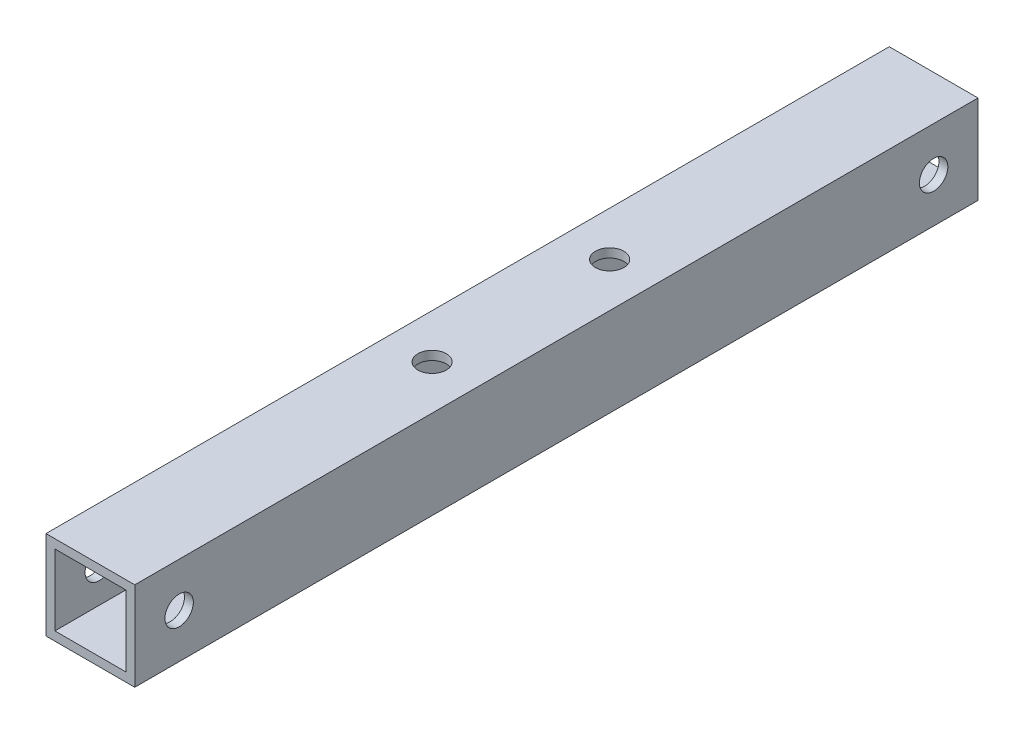
ISO-10303-21;
HEADER;
FILE_DESCRIPTION(('STEP AP214'),'2;1');
FILE_NAME('part.step','',(''),(''),'','','');
FILE_SCHEMA(('AUTOMOTIVE_DESIGN { 1 0 10303 214 1 1 1 1 }'));
ENDSEC;
DATA;
#1=APPLICATION_CONTEXT('core data for automotive mechanical design processes');
#2=APPLICATION_PROTOCOL_DEFINITION('international standard','automotive_design',2000,#1);
#3=PRODUCT_CONTEXT('',#1,'mechanical');
#4=PRODUCT('Part','Part','',(#3));
#5=PRODUCT_RELATED_PRODUCT_CATEGORY('part','',(#4));
#6=PRODUCT_DEFINITION_FORMATION('','',#4);
#7=PRODUCT_DEFINITION_CONTEXT('part definition',#1,'design');
#8=PRODUCT_DEFINITION('design','',#6,#7);
#9=PRODUCT_DEFINITION_SHAPE('','',#8);
#10=(LENGTH_UNIT() NAMED_UNIT(*) SI_UNIT(.MILLI.,.METRE.));
#11=(NAMED_UNIT(*) PLANE_ANGLE_UNIT() SI_UNIT($,.RADIAN.));
#12=(NAMED_UNIT(*) SI_UNIT($,.STERADIAN.) SOLID_ANGLE_UNIT());
#13=UNCERTAINTY_MEASURE_WITH_UNIT(LENGTH_MEASURE(1.E-05),#10,'distance_accuracy_value','');
#14=(GEOMETRIC_REPRESENTATION_CONTEXT(3) GLOBAL_UNCERTAINTY_ASSIGNED_CONTEXT((#13)) GLOBAL_UNIT_ASSIGNED_CONTEXT((#10,
#11,#12)) REPRESENTATION_CONTEXT('',''));
#15=CARTESIAN_POINT('',(0.,0.,0.));
#16=DIRECTION('',(0.,0.,1.));
#17=DIRECTION('',(1.,0.,0.));
#18=AXIS2_PLACEMENT_3D('',#15,#16,#17);
#19=CARTESIAN_POINT('',(0.,0.,95.));
#20=DIRECTION('',(0.,0.,1.));
#21=DIRECTION('',(1.,0.,0.));
#22=AXIS2_PLACEMENT_3D('',#19,#20,#21);
#23=PLANE('',#22);
#24=DIRECTION('',(0.,-1.,0.));
#25=VECTOR('',#24,1.);
#26=CARTESIAN_POINT('',(-5.,5.,95.));
#27=LINE('',#26,#25);
#28=CARTESIAN_POINT('',(-5.,5.,95.));
#29=VERTEX_POINT('',#28);
#30=CARTESIAN_POINT('',(-5.,-5.,95.));
#31=VERTEX_POINT('',#30);
#32=EDGE_CURVE('E164',#29,#31,#27,.T.);
#33=ORIENTED_EDGE('',*,*,#32,.T.);
#34=DIRECTION('',(1.,0.,0.));
#35=VECTOR('',#34,1.);
#36=CARTESIAN_POINT('',(5.,-5.,95.));
#37=LINE('',#36,#35);
#38=CARTESIAN_POINT('',(5.,-5.,95.));
#39=VERTEX_POINT('',#38);
#40=EDGE_CURVE('E167',#31,#39,#37,.T.);
#41=ORIENTED_EDGE('',*,*,#40,.T.);
#42=DIRECTION('',(0.,1.,0.));
#43=VECTOR('',#42,1.);
#44=CARTESIAN_POINT('',(5.,5.,95.));
#45=LINE('',#44,#43);
#46=CARTESIAN_POINT('',(5.,5.,95.));
#47=VERTEX_POINT('',#46);
#48=EDGE_CURVE('E170',#39,#47,#45,.T.);
#49=ORIENTED_EDGE('',*,*,#48,.T.);
#50=DIRECTION('',(-1.,0.,0.));
#51=VECTOR('',#50,1.);
#52=CARTESIAN_POINT('',(5.,5.,95.));
#53=LINE('',#52,#51);
#54=EDGE_CURVE('E172',#47,#29,#53,.T.);
#55=ORIENTED_EDGE('',*,*,#54,.T.);
#56=EDGE_LOOP('',(#33,#41,#49,#55));
#57=FACE_BOUND('',#56,.T.);
#58=DIRECTION('',(1.,0.,0.));
#59=VECTOR('',#58,1.);
#60=CARTESIAN_POINT('',(0.,-4.,95.));
#61=LINE('',#60,#59);
#62=CARTESIAN_POINT('',(-4.,-4.,95.));
#63=VERTEX_POINT('',#62);
#64=CARTESIAN_POINT('',(4.,-4.,95.));
#65=VERTEX_POINT('',#64);
#66=EDGE_CURVE('E134',#63,#65,#61,.T.);
#67=ORIENTED_EDGE('',*,*,#66,.F.);
#68=DIRECTION('',(0.,-1.,0.));
#69=VECTOR('',#68,1.);
#70=CARTESIAN_POINT('',(-4.,0.,95.));
#71=LINE('',#70,#69);
#72=CARTESIAN_POINT('',(-4.,4.,95.));
#73=VERTEX_POINT('',#72);
#74=EDGE_CURVE('E126',#73,#63,#71,.T.);
#75=ORIENTED_EDGE('',*,*,#74,.F.);
#76=DIRECTION('',(-1.,0.,0.));
#77=VECTOR('',#76,1.);
#78=CARTESIAN_POINT('',(0.,4.,95.));
#79=LINE('',#78,#77);
#80=CARTESIAN_POINT('',(4.,4.,95.));
#81=VERTEX_POINT('',#80);
#82=EDGE_CURVE('E148',#81,#73,#79,.T.);
#83=ORIENTED_EDGE('',*,*,#82,.F.);
#84=DIRECTION('',(0.,1.,0.));
#85=VECTOR('',#84,1.);
#86=CARTESIAN_POINT('',(4.,0.,95.));
#87=LINE('',#86,#85);
#88=EDGE_CURVE('E146',#65,#81,#87,.T.);
#89=ORIENTED_EDGE('',*,*,#88,.F.);
#90=EDGE_LOOP('',(#67,#75,#83,#89));
#91=FACE_BOUND('',#90,.T.);
#92=ADVANCED_FACE('F59',(#57,#91),#23,.T.);
#93=CARTESIAN_POINT('',(0.,0.,0.));
#94=DIRECTION('',(0.,0.,1.));
#95=DIRECTION('',(1.,0.,0.));
#96=AXIS2_PLACEMENT_3D('',#93,#94,#95);
#97=PLANE('',#96);
#98=DIRECTION('',(0.,-1.,0.));
#99=VECTOR('',#98,1.);
#100=CARTESIAN_POINT('',(-5.,5.,0.));
#101=LINE('',#100,#99);
#102=CARTESIAN_POINT('',(-5.,5.,0.));
#103=VERTEX_POINT('',#102);
#104=CARTESIAN_POINT('',(-5.,-5.,0.));
#105=VERTEX_POINT('',#104);
#106=EDGE_CURVE('E142',#103,#105,#101,.T.);
#107=ORIENTED_EDGE('',*,*,#106,.F.);
#108=DIRECTION('',(-1.,0.,0.));
#109=VECTOR('',#108,1.);
#110=CARTESIAN_POINT('',(5.,5.,0.));
#111=LINE('',#110,#109);
#112=CARTESIAN_POINT('',(5.,5.,0.));
#113=VERTEX_POINT('',#112);
#114=EDGE_CURVE('E168',#113,#103,#111,.T.);
#115=ORIENTED_EDGE('',*,*,#114,.F.);
#116=DIRECTION('',(0.,1.,0.));
#117=VECTOR('',#116,1.);
#118=CARTESIAN_POINT('',(5.,5.,0.));
#119=LINE('',#118,#117);
#120=CARTESIAN_POINT('',(5.,-5.,0.));
#121=VERTEX_POINT('',#120);
#122=EDGE_CURVE('E179',#121,#113,#119,.T.);
#123=ORIENTED_EDGE('',*,*,#122,.F.);
#124=DIRECTION('',(1.,0.,0.));
#125=VECTOR('',#124,1.);
#126=CARTESIAN_POINT('',(5.,-5.,0.));
#127=LINE('',#126,#125);
#128=EDGE_CURVE('E177',#105,#121,#127,.T.);
#129=ORIENTED_EDGE('',*,*,#128,.F.);
#130=EDGE_LOOP('',(#107,#115,#123,#129));
#131=FACE_BOUND('',#130,.T.);
#132=DIRECTION('',(0.,-1.,0.));
#133=VECTOR('',#132,1.);
#134=CARTESIAN_POINT('',(-4.,0.,0.));
#135=LINE('',#134,#133);
#136=CARTESIAN_POINT('',(-4.,4.,0.));
#137=VERTEX_POINT('',#136);
#138=CARTESIAN_POINT('',(-4.,-4.,0.));
#139=VERTEX_POINT('',#138);
#140=EDGE_CURVE('E84',#137,#139,#135,.T.);
#141=ORIENTED_EDGE('',*,*,#140,.T.);
#142=DIRECTION('',(1.,0.,0.));
#143=VECTOR('',#142,1.);
#144=CARTESIAN_POINT('',(0.,-4.,0.));
#145=LINE('',#144,#143);
#146=CARTESIAN_POINT('',(4.,-4.,0.));
#147=VERTEX_POINT('',#146);
#148=EDGE_CURVE('E141',#139,#147,#145,.T.);
#149=ORIENTED_EDGE('',*,*,#148,.T.);
#150=DIRECTION('',(0.,1.,0.));
#151=VECTOR('',#150,1.);
#152=CARTESIAN_POINT('',(4.,0.,0.));
#153=LINE('',#152,#151);
#154=CARTESIAN_POINT('',(4.,4.,0.));
#155=VERTEX_POINT('',#154);
#156=EDGE_CURVE('E156',#147,#155,#153,.T.);
#157=ORIENTED_EDGE('',*,*,#156,.T.);
#158=DIRECTION('',(-1.,0.,0.));
#159=VECTOR('',#158,1.);
#160=CARTESIAN_POINT('',(0.,4.,0.));
#161=LINE('',#160,#159);
#162=EDGE_CURVE('E135',#155,#137,#161,.T.);
#163=ORIENTED_EDGE('',*,*,#162,.T.);
#164=EDGE_LOOP('',(#141,#149,#157,#163));
#165=FACE_BOUND('',#164,.T.);
#166=ADVANCED_FACE('F267',(#131,#165),#97,.F.);
#167=CARTESIAN_POINT('',(-5.,5.,95.));
#168=DIRECTION('',(1.,0.,0.));
#169=DIRECTION('',(0.,1.,0.));
#170=AXIS2_PLACEMENT_3D('',#167,#168,#169);
#171=PLANE('',#170);
#172=CARTESIAN_POINT('',(-5.,0.,90.));
#173=DIRECTION('',(1.,0.,0.));
#174=DIRECTION('',(0.,1.,0.));
#175=AXIS2_PLACEMENT_3D('',#172,#173,#174);
#176=CIRCLE('',#175,1.60000000000001);
#177=CARTESIAN_POINT('',(-5.,1.6,90.));
#178=VERTEX_POINT('',#177);
#179=EDGE_CURVE('E199',#178,#178,#176,.T.);
#180=ORIENTED_EDGE('',*,*,#179,.T.);
#181=EDGE_LOOP('',(#180));
#182=FACE_BOUND('',#181,.T.);
#183=CARTESIAN_POINT('',(-5.,0.,5.));
#184=DIRECTION('',(1.,0.,0.));
#185=DIRECTION('',(0.,-1.,0.));
#186=AXIS2_PLACEMENT_3D('',#183,#184,#185);
#187=CIRCLE('',#186,1.6);
#188=CARTESIAN_POINT('',(-5.,-1.6,5.));
#189=VERTEX_POINT('',#188);
#190=EDGE_CURVE('E210',#189,#189,#187,.T.);
#191=ORIENTED_EDGE('',*,*,#190,.T.);
#192=EDGE_LOOP('',(#191));
#193=FACE_BOUND('',#192,.T.);
#194=ORIENTED_EDGE('',*,*,#106,.T.);
#195=DIRECTION('',(0.,0.,-1.));
#196=VECTOR('',#195,1.);
#197=CARTESIAN_POINT('',(-5.,-5.,95.));
#198=LINE('',#197,#196);
#199=EDGE_CURVE('E12',#31,#105,#198,.T.);
#200=ORIENTED_EDGE('',*,*,#199,.F.);
#201=ORIENTED_EDGE('',*,*,#32,.F.);
#202=DIRECTION('',(0.,0.,-1.));
#203=VECTOR('',#202,1.);
#204=CARTESIAN_POINT('',(-5.,5.,95.));
#205=LINE('',#204,#203);
#206=EDGE_CURVE('E174',#29,#103,#205,.T.);
#207=ORIENTED_EDGE('',*,*,#206,.T.);
#208=EDGE_LOOP('',(#194,#200,#201,#207));
#209=FACE_BOUND('',#208,.T.);
#210=ADVANCED_FACE('F61',(#182,#193,#209),#171,.F.);
#211=CARTESIAN_POINT('',(5.,-5.,95.));
#212=DIRECTION('',(0.,1.,0.));
#213=DIRECTION('',(-1.,0.,0.));
#214=AXIS2_PLACEMENT_3D('',#211,#212,#213);
#215=PLANE('',#214);
#216=CARTESIAN_POINT('',(0.,-5.,56.5));
#217=DIRECTION('',(0.,1.,0.));
#218=DIRECTION('',(-1.,0.,0.));
#219=AXIS2_PLACEMENT_3D('',#216,#217,#218);
#220=CIRCLE('',#219,1.6);
#221=CARTESIAN_POINT('',(-1.59999999999999,-5.,56.5));
#222=VERTEX_POINT('',#221);
#223=EDGE_CURVE('E193',#222,#222,#220,.T.);
#224=ORIENTED_EDGE('',*,*,#223,.T.);
#225=EDGE_LOOP('',(#224));
#226=FACE_BOUND('',#225,.T.);
#227=CARTESIAN_POINT('',(0.,-5.,36.5));
#228=DIRECTION('',(0.,1.,0.));
#229=DIRECTION('',(-1.,0.,0.));
#230=AXIS2_PLACEMENT_3D('',#227,#228,#229);
#231=CIRCLE('',#230,1.6);
#232=CARTESIAN_POINT('',(-1.59999999999999,-5.,36.5));
#233=VERTEX_POINT('',#232);
#234=EDGE_CURVE('E227',#233,#233,#231,.T.);
#235=ORIENTED_EDGE('',*,*,#234,.T.);
#236=EDGE_LOOP('',(#235));
#237=FACE_BOUND('',#236,.T.);
#238=ORIENTED_EDGE('',*,*,#128,.T.);
#239=DIRECTION('',(0.,0.,-1.));
#240=VECTOR('',#239,1.);
#241=CARTESIAN_POINT('',(5.,-5.,95.));
#242=LINE('',#241,#240);
#243=EDGE_CURVE('E68',#39,#121,#242,.T.);
#244=ORIENTED_EDGE('',*,*,#243,.F.);
#245=ORIENTED_EDGE('',*,*,#40,.F.);
#246=ORIENTED_EDGE('',*,*,#199,.T.);
#247=EDGE_LOOP('',(#238,#244,#245,#246));
#248=FACE_BOUND('',#247,.T.);
#249=ADVANCED_FACE('F253',(#226,#237,#248),#215,.F.);
#250=CARTESIAN_POINT('',(5.,5.,95.));
#251=DIRECTION('',(-1.,0.,0.));
#252=DIRECTION('',(0.,-1.,0.));
#253=AXIS2_PLACEMENT_3D('',#250,#251,#252);
#254=PLANE('',#253);
#255=CARTESIAN_POINT('',(5.,0.,90.));
#256=DIRECTION('',(1.,0.,0.));
#257=DIRECTION('',(0.,1.,0.));
#258=AXIS2_PLACEMENT_3D('',#255,#256,#257);
#259=CIRCLE('',#258,1.60000000000001);
#260=CARTESIAN_POINT('',(5.,1.60000000000001,90.));
#261=VERTEX_POINT('',#260);
#262=EDGE_CURVE('E205',#261,#261,#259,.T.);
#263=ORIENTED_EDGE('',*,*,#262,.F.);
#264=EDGE_LOOP('',(#263));
#265=FACE_BOUND('',#264,.T.);
#266=CARTESIAN_POINT('',(5.,0.,5.));
#267=DIRECTION('',(1.,0.,0.));
#268=DIRECTION('',(0.,-1.,0.));
#269=AXIS2_PLACEMENT_3D('',#266,#267,#268);
#270=CIRCLE('',#269,1.6);
#271=CARTESIAN_POINT('',(5.,-1.6,5.));
#272=VERTEX_POINT('',#271);
#273=EDGE_CURVE('E215',#272,#272,#270,.T.);
#274=ORIENTED_EDGE('',*,*,#273,.F.);
#275=EDGE_LOOP('',(#274));
#276=FACE_BOUND('',#275,.T.);
#277=ORIENTED_EDGE('',*,*,#122,.T.);
#278=DIRECTION('',(0.,0.,-1.));
#279=VECTOR('',#278,1.);
#280=CARTESIAN_POINT('',(5.,5.,95.));
#281=LINE('',#280,#279);
#282=EDGE_CURVE('E184',#47,#113,#281,.T.);
#283=ORIENTED_EDGE('',*,*,#282,.F.);
#284=ORIENTED_EDGE('',*,*,#48,.F.);
#285=ORIENTED_EDGE('',*,*,#243,.T.);
#286=EDGE_LOOP('',(#277,#283,#284,#285));
#287=FACE_BOUND('',#286,.T.);
#288=ADVANCED_FACE('F256',(#265,#276,#287),#254,.F.);
#289=CARTESIAN_POINT('',(5.,5.,95.));
#290=DIRECTION('',(0.,-1.,0.));
#291=DIRECTION('',(1.,0.,0.));
#292=AXIS2_PLACEMENT_3D('',#289,#290,#291);
#293=PLANE('',#292);
#294=CARTESIAN_POINT('',(0.,5.,56.5));
#295=DIRECTION('',(0.,1.,0.));
#296=DIRECTION('',(-1.,0.,0.));
#297=AXIS2_PLACEMENT_3D('',#294,#295,#296);
#298=CIRCLE('',#297,1.6);
#299=CARTESIAN_POINT('',(-1.59999999999999,5.,56.5));
#300=VERTEX_POINT('',#299);
#301=EDGE_CURVE('E224',#300,#300,#298,.T.);
#302=ORIENTED_EDGE('',*,*,#301,.F.);
#303=EDGE_LOOP('',(#302));
#304=FACE_BOUND('',#303,.T.);
#305=CARTESIAN_POINT('',(0.,5.,36.5));
#306=DIRECTION('',(0.,1.,0.));
#307=DIRECTION('',(-1.,0.,0.));
#308=AXIS2_PLACEMENT_3D('',#305,#306,#307);
#309=CIRCLE('',#308,1.6);
#310=CARTESIAN_POINT('',(-1.59999999999999,5.,36.5));
#311=VERTEX_POINT('',#310);
#312=EDGE_CURVE('E221',#311,#311,#309,.T.);
#313=ORIENTED_EDGE('',*,*,#312,.F.);
#314=EDGE_LOOP('',(#313));
#315=FACE_BOUND('',#314,.T.);
#316=ORIENTED_EDGE('',*,*,#114,.T.);
#317=ORIENTED_EDGE('',*,*,#206,.F.);
#318=ORIENTED_EDGE('',*,*,#54,.F.);
#319=ORIENTED_EDGE('',*,*,#282,.T.);
#320=EDGE_LOOP('',(#316,#317,#318,#319));
#321=FACE_BOUND('',#320,.T.);
#322=ADVANCED_FACE('F271',(#304,#315,#321),#293,.F.);
#323=CARTESIAN_POINT('',(-4.,0.,95.));
#324=DIRECTION('',(1.,0.,0.));
#325=DIRECTION('',(0.,1.,0.));
#326=AXIS2_PLACEMENT_3D('',#323,#324,#325);
#327=PLANE('',#326);
#328=CARTESIAN_POINT('',(-4.,0.,90.));
#329=DIRECTION('',(1.,0.,0.));
#330=DIRECTION('',(0.,1.,0.));
#331=AXIS2_PLACEMENT_3D('',#328,#329,#330);
#332=CIRCLE('',#331,1.60000000000001);
#333=CARTESIAN_POINT('',(-4.,1.6,90.));
#334=VERTEX_POINT('',#333);
#335=EDGE_CURVE('E218',#334,#334,#332,.T.);
#336=ORIENTED_EDGE('',*,*,#335,.F.);
#337=EDGE_LOOP('',(#336));
#338=FACE_BOUND('',#337,.T.);
#339=CARTESIAN_POINT('',(-4.,0.,5.));
#340=DIRECTION('',(1.,0.,0.));
#341=DIRECTION('',(0.,1.,0.));
#342=AXIS2_PLACEMENT_3D('',#339,#340,#341);
#343=CIRCLE('',#342,1.6);
#344=CARTESIAN_POINT('',(-4.,1.6,5.));
#345=VERTEX_POINT('',#344);
#346=EDGE_CURVE('E198',#345,#345,#343,.T.);
#347=ORIENTED_EDGE('',*,*,#346,.F.);
#348=EDGE_LOOP('',(#347));
#349=FACE_BOUND('',#348,.T.);
#350=ORIENTED_EDGE('',*,*,#140,.F.);
#351=DIRECTION('',(0.,0.,-1.));
#352=VECTOR('',#351,1.);
#353=CARTESIAN_POINT('',(-4.,4.,95.));
#354=LINE('',#353,#352);
#355=EDGE_CURVE('E130',#73,#137,#354,.T.);
#356=ORIENTED_EDGE('',*,*,#355,.F.);
#357=ORIENTED_EDGE('',*,*,#74,.T.);
#358=DIRECTION('',(0.,0.,-1.));
#359=VECTOR('',#358,1.);
#360=CARTESIAN_POINT('',(-4.,-4.,95.));
#361=LINE('',#360,#359);
#362=EDGE_CURVE('E129',#63,#139,#361,.T.);
#363=ORIENTED_EDGE('',*,*,#362,.T.);
#364=EDGE_LOOP('',(#350,#356,#357,#363));
#365=FACE_BOUND('',#364,.T.);
#366=ADVANCED_FACE('F128',(#338,#349,#365),#327,.T.);
#367=CARTESIAN_POINT('',(0.,-4.,95.));
#368=DIRECTION('',(0.,1.,0.));
#369=DIRECTION('',(-1.,0.,0.));
#370=AXIS2_PLACEMENT_3D('',#367,#368,#369);
#371=PLANE('',#370);
#372=CARTESIAN_POINT('',(0.,-4.,56.5));
#373=DIRECTION('',(0.,1.,0.));
#374=DIRECTION('',(-1.,0.,0.));
#375=AXIS2_PLACEMENT_3D('',#372,#373,#374);
#376=CIRCLE('',#375,1.6);
#377=CARTESIAN_POINT('',(-1.59999999999999,-4.,56.5));
#378=VERTEX_POINT('',#377);
#379=EDGE_CURVE('E154',#378,#378,#376,.T.);
#380=ORIENTED_EDGE('',*,*,#379,.F.);
#381=EDGE_LOOP('',(#380));
#382=FACE_BOUND('',#381,.T.);
#383=CARTESIAN_POINT('',(0.,-4.,36.5));
#384=DIRECTION('',(0.,1.,0.));
#385=DIRECTION('',(-1.,0.,0.));
#386=AXIS2_PLACEMENT_3D('',#383,#384,#385);
#387=CIRCLE('',#386,1.6);
#388=CARTESIAN_POINT('',(-1.59999999999999,-4.,36.5));
#389=VERTEX_POINT('',#388);
#390=EDGE_CURVE('E192',#389,#389,#387,.T.);
#391=ORIENTED_EDGE('',*,*,#390,.F.);
#392=EDGE_LOOP('',(#391));
#393=FACE_BOUND('',#392,.T.);
#394=ORIENTED_EDGE('',*,*,#148,.F.);
#395=ORIENTED_EDGE('',*,*,#362,.F.);
#396=ORIENTED_EDGE('',*,*,#66,.T.);
#397=DIRECTION('',(0.,0.,-1.));
#398=VECTOR('',#397,1.);
#399=CARTESIAN_POINT('',(4.,-4.,95.));
#400=LINE('',#399,#398);
#401=EDGE_CURVE('E143',#65,#147,#400,.T.);
#402=ORIENTED_EDGE('',*,*,#401,.T.);
#403=EDGE_LOOP('',(#394,#395,#396,#402));
#404=FACE_BOUND('',#403,.T.);
#405=ADVANCED_FACE('F138',(#382,#393,#404),#371,.T.);
#406=CARTESIAN_POINT('',(4.,0.,95.));
#407=DIRECTION('',(-1.,0.,0.));
#408=DIRECTION('',(0.,-1.,0.));
#409=AXIS2_PLACEMENT_3D('',#406,#407,#408);
#410=PLANE('',#409);
#411=CARTESIAN_POINT('',(4.,0.,90.));
#412=DIRECTION('',(-1.,0.,0.));
#413=DIRECTION('',(0.,-1.,0.));
#414=AXIS2_PLACEMENT_3D('',#411,#412,#413);
#415=CIRCLE('',#414,1.60000000000001);
#416=CARTESIAN_POINT('',(4.,-1.6,90.));
#417=VERTEX_POINT('',#416);
#418=EDGE_CURVE('E63',#417,#417,#415,.T.);
#419=ORIENTED_EDGE('',*,*,#418,.F.);
#420=EDGE_LOOP('',(#419));
#421=FACE_BOUND('',#420,.T.);
#422=CARTESIAN_POINT('',(4.,0.,5.));
#423=DIRECTION('',(-1.,0.,0.));
#424=DIRECTION('',(0.,-1.,0.));
#425=AXIS2_PLACEMENT_3D('',#422,#423,#424);
#426=CIRCLE('',#425,1.6);
#427=CARTESIAN_POINT('',(4.,-1.6,5.));
#428=VERTEX_POINT('',#427);
#429=EDGE_CURVE('E196',#428,#428,#426,.T.);
#430=ORIENTED_EDGE('',*,*,#429,.F.);
#431=EDGE_LOOP('',(#430));
#432=FACE_BOUND('',#431,.T.);
#433=ORIENTED_EDGE('',*,*,#156,.F.);
#434=ORIENTED_EDGE('',*,*,#401,.F.);
#435=ORIENTED_EDGE('',*,*,#88,.T.);
#436=DIRECTION('',(0.,0.,-1.));
#437=VECTOR('',#436,1.);
#438=CARTESIAN_POINT('',(4.,4.,95.));
#439=LINE('',#438,#437);
#440=EDGE_CURVE('E76',#81,#155,#439,.T.);
#441=ORIENTED_EDGE('',*,*,#440,.T.);
#442=EDGE_LOOP('',(#433,#434,#435,#441));
#443=FACE_BOUND('',#442,.T.);
#444=ADVANCED_FACE('F241',(#421,#432,#443),#410,.T.);
#445=CARTESIAN_POINT('',(0.,4.,95.));
#446=DIRECTION('',(0.,-1.,0.));
#447=DIRECTION('',(1.,0.,0.));
#448=AXIS2_PLACEMENT_3D('',#445,#446,#447);
#449=PLANE('',#448);
#450=CARTESIAN_POINT('',(0.,4.,56.5));
#451=DIRECTION('',(0.,-1.,0.));
#452=DIRECTION('',(1.,0.,0.));
#453=AXIS2_PLACEMENT_3D('',#450,#451,#452);
#454=CIRCLE('',#453,1.6);
#455=CARTESIAN_POINT('',(-1.59999999999999,4.,56.5));
#456=VERTEX_POINT('',#455);
#457=EDGE_CURVE('E194',#456,#456,#454,.T.);
#458=ORIENTED_EDGE('',*,*,#457,.F.);
#459=EDGE_LOOP('',(#458));
#460=FACE_BOUND('',#459,.T.);
#461=CARTESIAN_POINT('',(0.,4.,36.5));
#462=DIRECTION('',(0.,-1.,0.));
#463=DIRECTION('',(1.,0.,0.));
#464=AXIS2_PLACEMENT_3D('',#461,#462,#463);
#465=CIRCLE('',#464,1.6);
#466=CARTESIAN_POINT('',(-1.59999999999999,4.,36.5));
#467=VERTEX_POINT('',#466);
#468=EDGE_CURVE('E189',#467,#467,#465,.T.);
#469=ORIENTED_EDGE('',*,*,#468,.F.);
#470=EDGE_LOOP('',(#469));
#471=FACE_BOUND('',#470,.T.);
#472=ORIENTED_EDGE('',*,*,#162,.F.);
#473=ORIENTED_EDGE('',*,*,#440,.F.);
#474=ORIENTED_EDGE('',*,*,#82,.T.);
#475=ORIENTED_EDGE('',*,*,#355,.T.);
#476=EDGE_LOOP('',(#472,#473,#474,#475));
#477=FACE_BOUND('',#476,.T.);
#478=ADVANCED_FACE('F352',(#460,#471,#477),#449,.T.);
#479=CARTESIAN_POINT('',(0.,-5.,36.5));
#480=DIRECTION('',(0.,1.,0.));
#481=DIRECTION('',(-1.,0.,0.));
#482=AXIS2_PLACEMENT_3D('',#479,#480,#481);
#483=CYLINDRICAL_SURFACE('',#482,1.6);
#484=CARTESIAN_POINT('',(-1.59999999999999,4.,36.5));
#485=CARTESIAN_POINT('',(-1.59999999999999,4.01041666666667,36.5));
#486=CARTESIAN_POINT('',(-1.59999999999999,4.02083333333333,36.5));
#487=CARTESIAN_POINT('',(-1.59999999999999,4.04166666666667,36.5));
#488=CARTESIAN_POINT('',(-1.59999999999999,4.05208333333333,36.5));
#489=CARTESIAN_POINT('',(-1.59999999999999,4.07291666666667,36.5));
#490=CARTESIAN_POINT('',(-1.59999999999999,4.08333333333333,36.5));
#491=CARTESIAN_POINT('',(-1.59999999999999,4.10416666666667,36.5));
#492=CARTESIAN_POINT('',(-1.59999999999999,4.11458333333333,36.5));
#493=CARTESIAN_POINT('',(-1.59999999999999,4.13541666666667,36.5));
#494=CARTESIAN_POINT('',(-1.59999999999999,4.14583333333333,36.5));
#495=CARTESIAN_POINT('',(-1.59999999999999,4.16666666666667,36.5));
#496=CARTESIAN_POINT('',(-1.59999999999999,4.17708333333333,36.5));
#497=CARTESIAN_POINT('',(-1.59999999999999,4.19791666666667,36.5));
#498=CARTESIAN_POINT('',(-1.59999999999999,4.20833333333333,36.5));
#499=CARTESIAN_POINT('',(-1.59999999999999,4.22916666666667,36.5));
#500=CARTESIAN_POINT('',(-1.59999999999999,4.23958333333333,36.5));
#501=CARTESIAN_POINT('',(-1.59999999999999,4.26041666666667,36.5));
#502=CARTESIAN_POINT('',(-1.59999999999999,4.27083333333333,36.5));
#503=CARTESIAN_POINT('',(-1.59999999999999,4.29166666666667,36.5));
#504=CARTESIAN_POINT('',(-1.59999999999999,4.30208333333333,36.5));
#505=CARTESIAN_POINT('',(-1.59999999999999,4.32291666666667,36.5));
#506=CARTESIAN_POINT('',(-1.59999999999999,4.33333333333333,36.5));
#507=CARTESIAN_POINT('',(-1.59999999999999,4.35416666666667,36.5));
#508=CARTESIAN_POINT('',(-1.59999999999999,4.36458333333333,36.5));
#509=CARTESIAN_POINT('',(-1.59999999999999,4.38541666666667,36.5));
#510=CARTESIAN_POINT('',(-1.59999999999999,4.39583333333333,36.5));
#511=CARTESIAN_POINT('',(-1.59999999999999,4.41666666666667,36.5));
#512=CARTESIAN_POINT('',(-1.59999999999999,4.42708333333333,36.5));
#513=CARTESIAN_POINT('',(-1.59999999999999,4.44791666666667,36.5));
#514=CARTESIAN_POINT('',(-1.59999999999999,4.45833333333333,36.5));
#515=CARTESIAN_POINT('',(-1.59999999999999,4.47916666666667,36.5));
#516=CARTESIAN_POINT('',(-1.59999999999999,4.48958333333333,36.5));
#517=CARTESIAN_POINT('',(-1.59999999999999,4.51041666666667,36.5));
#518=CARTESIAN_POINT('',(-1.59999999999999,4.52083333333333,36.5));
#519=CARTESIAN_POINT('',(-1.59999999999999,4.54166666666667,36.5));
#520=CARTESIAN_POINT('',(-1.59999999999999,4.55208333333333,36.5));
#521=CARTESIAN_POINT('',(-1.59999999999999,4.57291666666667,36.5));
#522=CARTESIAN_POINT('',(-1.59999999999999,4.58333333333333,36.5));
#523=CARTESIAN_POINT('',(-1.59999999999999,4.60416666666667,36.5));
#524=CARTESIAN_POINT('',(-1.59999999999999,4.61458333333333,36.5));
#525=CARTESIAN_POINT('',(-1.59999999999999,4.63541666666667,36.5));
#526=CARTESIAN_POINT('',(-1.59999999999999,4.64583333333333,36.5));
#527=CARTESIAN_POINT('',(-1.59999999999999,4.66666666666667,36.5));
#528=CARTESIAN_POINT('',(-1.59999999999999,4.67708333333333,36.5));
#529=CARTESIAN_POINT('',(-1.59999999999999,4.69791666666667,36.5));
#530=CARTESIAN_POINT('',(-1.59999999999999,4.70833333333333,36.5));
#531=CARTESIAN_POINT('',(-1.59999999999999,4.72916666666667,36.5));
#532=CARTESIAN_POINT('',(-1.59999999999999,4.73958333333333,36.5));
#533=CARTESIAN_POINT('',(-1.59999999999999,4.76041666666667,36.5));
#534=CARTESIAN_POINT('',(-1.59999999999999,4.77083333333333,36.5));
#535=CARTESIAN_POINT('',(-1.59999999999999,4.79166666666667,36.5));
#536=CARTESIAN_POINT('',(-1.59999999999999,4.80208333333333,36.5));
#537=CARTESIAN_POINT('',(-1.59999999999999,4.82291666666667,36.5));
#538=CARTESIAN_POINT('',(-1.59999999999999,4.83333333333333,36.5));
#539=CARTESIAN_POINT('',(-1.59999999999999,4.85416666666667,36.5));
#540=CARTESIAN_POINT('',(-1.59999999999999,4.86458333333333,36.5));
#541=CARTESIAN_POINT('',(-1.59999999999999,4.88541666666667,36.5));
#542=CARTESIAN_POINT('',(-1.59999999999999,4.89583333333333,36.5));
#543=CARTESIAN_POINT('',(-1.59999999999999,4.91666666666667,36.5));
#544=CARTESIAN_POINT('',(-1.59999999999999,4.92708333333333,36.5));
#545=CARTESIAN_POINT('',(-1.59999999999999,4.94791666666667,36.5));
#546=CARTESIAN_POINT('',(-1.59999999999999,4.95833333333333,36.5));
#547=CARTESIAN_POINT('',(-1.59999999999999,4.97916666666667,36.5));
#548=CARTESIAN_POINT('',(-1.59999999999999,4.98958333333333,36.5));
#549=CARTESIAN_POINT('',(-1.59999999999999,5.,36.5));
#550=B_SPLINE_CURVE_WITH_KNOTS('',3,(#484,#485,#486,#487,#488,#489,#490,#491,#492,#493,#494,
#495,#496,#497,#498,#499,#500,#501,#502,#503,#504,#505,#506,#507,#508,#509,#510,#511,#512,#513,
#514,#515,#516,#517,#518,#519,#520,#521,#522,#523,#524,#525,#526,#527,#528,#529,#530,#531,#532,
#533,#534,#535,#536,#537,#538,#539,#540,#541,#542,#543,#544,#545,#546,#547,#548,#549),
.UNSPECIFIED.,.F.,.F.,(4,2,2,2,2,2,2,2,2,2,2,2,2,2,2,2,2,2,2,2,2,2,2,2,2,2,2,2,2,2,2,2,4),(0.,
0.03125,0.0625000000000001,0.0937500000000001,0.125,0.15625,0.1875,0.21875,0.25,0.28125,0.3125,
0.34375,0.375,0.40625,0.4375,0.46875,0.5,0.53125,0.5625,0.593750000000001,0.625000000000001,
0.656250000000001,0.687500000000001,0.718750000000001,0.750000000000001,0.781250000000001,
0.812500000000001,0.843750000000001,0.875000000000001,0.906250000000001,0.937500000000001,
0.968750000000001,1.),.UNSPECIFIED.);
#551=EDGE_CURVE('BSEAM250',#467,#311,#550,.T.);
#552=ORIENTED_EDGE('',*,*,#468,.T.);
#553=ORIENTED_EDGE('',*,*,#312,.T.);
#554=ORIENTED_EDGE('',*,*,#551,.T.);
#555=ORIENTED_EDGE('',*,*,#551,.F.);
#556=EDGE_LOOP('',(#552,#554,#553,#555));
#557=FACE_BOUND('',#556,.T.);
#558=ADVANCED_FACE('F250',(#557),#483,.F.);
#559=CARTESIAN_POINT('',(0.,-5.,56.5));
#560=DIRECTION('',(0.,1.,0.));
#561=DIRECTION('',(-1.,0.,0.));
#562=AXIS2_PLACEMENT_3D('',#559,#560,#561);
#563=CYLINDRICAL_SURFACE('',#562,1.6);
#564=CARTESIAN_POINT('',(-1.59999999999999,4.,56.5));
#565=CARTESIAN_POINT('',(-1.59999999999999,4.01041666666667,56.5));
#566=CARTESIAN_POINT('',(-1.59999999999999,4.02083333333333,56.5));
#567=CARTESIAN_POINT('',(-1.59999999999999,4.04166666666667,56.5));
#568=CARTESIAN_POINT('',(-1.59999999999999,4.05208333333333,56.5));
#569=CARTESIAN_POINT('',(-1.59999999999999,4.07291666666667,56.5));
#570=CARTESIAN_POINT('',(-1.59999999999999,4.08333333333333,56.5));
#571=CARTESIAN_POINT('',(-1.59999999999999,4.10416666666667,56.5));
#572=CARTESIAN_POINT('',(-1.59999999999999,4.11458333333333,56.5));
#573=CARTESIAN_POINT('',(-1.59999999999999,4.13541666666667,56.5));
#574=CARTESIAN_POINT('',(-1.59999999999999,4.14583333333333,56.5));
#575=CARTESIAN_POINT('',(-1.59999999999999,4.16666666666667,56.5));
#576=CARTESIAN_POINT('',(-1.59999999999999,4.17708333333333,56.5));
#577=CARTESIAN_POINT('',(-1.59999999999999,4.19791666666667,56.5));
#578=CARTESIAN_POINT('',(-1.59999999999999,4.20833333333333,56.5));
#579=CARTESIAN_POINT('',(-1.59999999999999,4.22916666666667,56.5));
#580=CARTESIAN_POINT('',(-1.59999999999999,4.23958333333333,56.5));
#581=CARTESIAN_POINT('',(-1.59999999999999,4.26041666666667,56.5));
#582=CARTESIAN_POINT('',(-1.59999999999999,4.27083333333333,56.5));
#583=CARTESIAN_POINT('',(-1.59999999999999,4.29166666666667,56.5));
#584=CARTESIAN_POINT('',(-1.59999999999999,4.30208333333333,56.5));
#585=CARTESIAN_POINT('',(-1.59999999999999,4.32291666666667,56.5));
#586=CARTESIAN_POINT('',(-1.59999999999999,4.33333333333333,56.5));
#587=CARTESIAN_POINT('',(-1.59999999999999,4.35416666666667,56.5));
#588=CARTESIAN_POINT('',(-1.59999999999999,4.36458333333333,56.5));
#589=CARTESIAN_POINT('',(-1.59999999999999,4.38541666666667,56.5));
#590=CARTESIAN_POINT('',(-1.59999999999999,4.39583333333333,56.5));
#591=CARTESIAN_POINT('',(-1.59999999999999,4.41666666666667,56.5));
#592=CARTESIAN_POINT('',(-1.59999999999999,4.42708333333333,56.5));
#593=CARTESIAN_POINT('',(-1.59999999999999,4.44791666666667,56.5));
#594=CARTESIAN_POINT('',(-1.59999999999999,4.45833333333333,56.5));
#595=CARTESIAN_POINT('',(-1.59999999999999,4.47916666666667,56.5));
#596=CARTESIAN_POINT('',(-1.59999999999999,4.48958333333333,56.5));
#597=CARTESIAN_POINT('',(-1.59999999999999,4.51041666666667,56.5));
#598=CARTESIAN_POINT('',(-1.59999999999999,4.52083333333333,56.5));
#599=CARTESIAN_POINT('',(-1.59999999999999,4.54166666666667,56.5));
#600=CARTESIAN_POINT('',(-1.59999999999999,4.55208333333333,56.5));
#601=CARTESIAN_POINT('',(-1.59999999999999,4.57291666666667,56.5));
#602=CARTESIAN_POINT('',(-1.59999999999999,4.58333333333333,56.5));
#603=CARTESIAN_POINT('',(-1.59999999999999,4.60416666666667,56.5));
#604=CARTESIAN_POINT('',(-1.59999999999999,4.61458333333333,56.5));
#605=CARTESIAN_POINT('',(-1.59999999999999,4.63541666666667,56.5));
#606=CARTESIAN_POINT('',(-1.59999999999999,4.64583333333333,56.5));
#607=CARTESIAN_POINT('',(-1.59999999999999,4.66666666666667,56.5));
#608=CARTESIAN_POINT('',(-1.59999999999999,4.67708333333333,56.5));
#609=CARTESIAN_POINT('',(-1.59999999999999,4.69791666666667,56.5));
#610=CARTESIAN_POINT('',(-1.59999999999999,4.70833333333333,56.5));
#611=CARTESIAN_POINT('',(-1.59999999999999,4.72916666666667,56.5));
#612=CARTESIAN_POINT('',(-1.59999999999999,4.73958333333333,56.5));
#613=CARTESIAN_POINT('',(-1.59999999999999,4.76041666666667,56.5));
#614=CARTESIAN_POINT('',(-1.59999999999999,4.77083333333333,56.5));
#615=CARTESIAN_POINT('',(-1.59999999999999,4.79166666666667,56.5));
#616=CARTESIAN_POINT('',(-1.59999999999999,4.80208333333333,56.5));
#617=CARTESIAN_POINT('',(-1.59999999999999,4.82291666666667,56.5));
#618=CARTESIAN_POINT('',(-1.59999999999999,4.83333333333333,56.5));
#619=CARTESIAN_POINT('',(-1.59999999999999,4.85416666666667,56.5));
#620=CARTESIAN_POINT('',(-1.59999999999999,4.86458333333333,56.5));
#621=CARTESIAN_POINT('',(-1.59999999999999,4.88541666666667,56.5));
#622=CARTESIAN_POINT('',(-1.59999999999999,4.89583333333333,56.5));
#623=CARTESIAN_POINT('',(-1.59999999999999,4.91666666666667,56.5));
#624=CARTESIAN_POINT('',(-1.59999999999999,4.92708333333333,56.5));
#625=CARTESIAN_POINT('',(-1.59999999999999,4.94791666666667,56.5));
#626=CARTESIAN_POINT('',(-1.59999999999999,4.95833333333333,56.5));
#627=CARTESIAN_POINT('',(-1.59999999999999,4.97916666666667,56.5));
#628=CARTESIAN_POINT('',(-1.59999999999999,4.98958333333333,56.5));
#629=CARTESIAN_POINT('',(-1.59999999999999,5.,56.5));
#630=B_SPLINE_CURVE_WITH_KNOTS('',3,(#564,#565,#566,#567,#568,#569,#570,#571,#572,#573,#574,
#575,#576,#577,#578,#579,#580,#581,#582,#583,#584,#585,#586,#587,#588,#589,#590,#591,#592,#593,
#594,#595,#596,#597,#598,#599,#600,#601,#602,#603,#604,#605,#606,#607,#608,#609,#610,#611,#612,
#613,#614,#615,#616,#617,#618,#619,#620,#621,#622,#623,#624,#625,#626,#627,#628,#629),
.UNSPECIFIED.,.F.,.F.,(4,2,2,2,2,2,2,2,2,2,2,2,2,2,2,2,2,2,2,2,2,2,2,2,2,2,2,2,2,2,2,2,4),(0.,
0.03125,0.0625000000000001,0.0937500000000001,0.125,0.15625,0.1875,0.21875,0.25,0.28125,0.3125,
0.34375,0.375,0.40625,0.4375,0.46875,0.5,0.53125,0.5625,0.593750000000001,0.625000000000001,
0.656250000000001,0.687500000000001,0.718750000000001,0.750000000000001,0.781250000000001,
0.812500000000001,0.843750000000001,0.875000000000001,0.906250000000001,0.937500000000001,
0.968750000000001,1.),.UNSPECIFIED.);
#631=EDGE_CURVE('BSEAM248',#456,#300,#630,.T.);
#632=ORIENTED_EDGE('',*,*,#457,.T.);
#633=ORIENTED_EDGE('',*,*,#301,.T.);
#634=ORIENTED_EDGE('',*,*,#631,.T.);
#635=ORIENTED_EDGE('',*,*,#631,.F.);
#636=EDGE_LOOP('',(#632,#634,#633,#635));
#637=FACE_BOUND('',#636,.T.);
#638=ADVANCED_FACE('F248',(#637),#563,.F.);
#639=CARTESIAN_POINT('',(-1.59999999999999,-4.,36.5));
#640=CARTESIAN_POINT('',(-1.59999999999999,-4.01041666666667,36.5));
#641=CARTESIAN_POINT('',(-1.59999999999999,-4.02083333333333,36.5));
#642=CARTESIAN_POINT('',(-1.59999999999999,-4.04166666666667,36.5));
#643=CARTESIAN_POINT('',(-1.59999999999999,-4.05208333333333,36.5));
#644=CARTESIAN_POINT('',(-1.59999999999999,-4.07291666666667,36.5));
#645=CARTESIAN_POINT('',(-1.59999999999999,-4.08333333333333,36.5));
#646=CARTESIAN_POINT('',(-1.59999999999999,-4.10416666666667,36.5));
#647=CARTESIAN_POINT('',(-1.59999999999999,-4.11458333333333,36.5));
#648=CARTESIAN_POINT('',(-1.59999999999999,-4.13541666666667,36.5));
#649=CARTESIAN_POINT('',(-1.59999999999999,-4.14583333333333,36.5));
#650=CARTESIAN_POINT('',(-1.59999999999999,-4.16666666666667,36.5));
#651=CARTESIAN_POINT('',(-1.59999999999999,-4.17708333333333,36.5));
#652=CARTESIAN_POINT('',(-1.59999999999999,-4.19791666666667,36.5));
#653=CARTESIAN_POINT('',(-1.59999999999999,-4.20833333333333,36.5));
#654=CARTESIAN_POINT('',(-1.59999999999999,-4.22916666666667,36.5));
#655=CARTESIAN_POINT('',(-1.59999999999999,-4.23958333333333,36.5));
#656=CARTESIAN_POINT('',(-1.59999999999999,-4.26041666666667,36.5));
#657=CARTESIAN_POINT('',(-1.59999999999999,-4.27083333333333,36.5));
#658=CARTESIAN_POINT('',(-1.59999999999999,-4.29166666666667,36.5));
#659=CARTESIAN_POINT('',(-1.59999999999999,-4.30208333333334,36.5));
#660=CARTESIAN_POINT('',(-1.59999999999999,-4.32291666666667,36.5));
#661=CARTESIAN_POINT('',(-1.59999999999999,-4.33333333333334,36.5));
#662=CARTESIAN_POINT('',(-1.59999999999999,-4.35416666666667,36.5));
#663=CARTESIAN_POINT('',(-1.59999999999999,-4.36458333333334,36.5));
#664=CARTESIAN_POINT('',(-1.59999999999999,-4.38541666666667,36.5));
#665=CARTESIAN_POINT('',(-1.59999999999999,-4.39583333333334,36.5));
#666=CARTESIAN_POINT('',(-1.59999999999999,-4.41666666666667,36.5));
#667=CARTESIAN_POINT('',(-1.59999999999999,-4.42708333333334,36.5));
#668=CARTESIAN_POINT('',(-1.59999999999999,-4.44791666666667,36.5));
#669=CARTESIAN_POINT('',(-1.59999999999999,-4.45833333333334,36.5));
#670=CARTESIAN_POINT('',(-1.59999999999999,-4.47916666666667,36.5));
#671=CARTESIAN_POINT('',(-1.59999999999999,-4.48958333333334,36.5));
#672=CARTESIAN_POINT('',(-1.59999999999999,-4.51041666666667,36.5));
#673=CARTESIAN_POINT('',(-1.59999999999999,-4.52083333333334,36.5));
#674=CARTESIAN_POINT('',(-1.59999999999999,-4.54166666666667,36.5));
#675=CARTESIAN_POINT('',(-1.59999999999999,-4.55208333333334,36.5));
#676=CARTESIAN_POINT('',(-1.59999999999999,-4.57291666666667,36.5));
#677=CARTESIAN_POINT('',(-1.59999999999999,-4.58333333333334,36.5));
#678=CARTESIAN_POINT('',(-1.59999999999999,-4.60416666666667,36.5));
#679=CARTESIAN_POINT('',(-1.59999999999999,-4.61458333333334,36.5));
#680=CARTESIAN_POINT('',(-1.59999999999999,-4.63541666666667,36.5));
#681=CARTESIAN_POINT('',(-1.59999999999999,-4.64583333333334,36.5));
#682=CARTESIAN_POINT('',(-1.59999999999999,-4.66666666666667,36.5));
#683=CARTESIAN_POINT('',(-1.59999999999999,-4.67708333333334,36.5));
#684=CARTESIAN_POINT('',(-1.59999999999999,-4.69791666666667,36.5));
#685=CARTESIAN_POINT('',(-1.59999999999999,-4.70833333333334,36.5));
#686=CARTESIAN_POINT('',(-1.59999999999999,-4.72916666666667,36.5));
#687=CARTESIAN_POINT('',(-1.59999999999999,-4.73958333333334,36.5));
#688=CARTESIAN_POINT('',(-1.59999999999999,-4.76041666666667,36.5));
#689=CARTESIAN_POINT('',(-1.59999999999999,-4.77083333333334,36.5));
#690=CARTESIAN_POINT('',(-1.59999999999999,-4.79166666666667,36.5));
#691=CARTESIAN_POINT('',(-1.59999999999999,-4.80208333333334,36.5));
#692=CARTESIAN_POINT('',(-1.59999999999999,-4.82291666666667,36.5));
#693=CARTESIAN_POINT('',(-1.59999999999999,-4.83333333333334,36.5));
#694=CARTESIAN_POINT('',(-1.59999999999999,-4.85416666666667,36.5));
#695=CARTESIAN_POINT('',(-1.59999999999999,-4.86458333333334,36.5));
#696=CARTESIAN_POINT('',(-1.59999999999999,-4.88541666666667,36.5));
#697=CARTESIAN_POINT('',(-1.59999999999999,-4.89583333333334,36.5));
#698=CARTESIAN_POINT('',(-1.59999999999999,-4.91666666666667,36.5));
#699=CARTESIAN_POINT('',(-1.59999999999999,-4.92708333333334,36.5));
#700=CARTESIAN_POINT('',(-1.59999999999999,-4.94791666666667,36.5));
#701=CARTESIAN_POINT('',(-1.59999999999999,-4.95833333333334,36.5));
#702=CARTESIAN_POINT('',(-1.59999999999999,-4.97916666666667,36.5));
#703=CARTESIAN_POINT('',(-1.59999999999999,-4.98958333333334,36.5));
#704=CARTESIAN_POINT('',(-1.59999999999999,-5.,36.5));
#705=B_SPLINE_CURVE_WITH_KNOTS('',3,(#639,#640,#641,#642,#643,#644,#645,#646,#647,#648,#649,
#650,#651,#652,#653,#654,#655,#656,#657,#658,#659,#660,#661,#662,#663,#664,#665,#666,#667,#668,
#669,#670,#671,#672,#673,#674,#675,#676,#677,#678,#679,#680,#681,#682,#683,#684,#685,#686,#687,
#688,#689,#690,#691,#692,#693,#694,#695,#696,#697,#698,#699,#700,#701,#702,#703,#704),
.UNSPECIFIED.,.F.,.F.,(4,2,2,2,2,2,2,2,2,2,2,2,2,2,2,2,2,2,2,2,2,2,2,2,2,2,2,2,2,2,2,2,4),(0.,
0.03125,0.0625000000000001,0.0937500000000001,0.125,0.15625,0.1875,0.21875,0.25,
0.281250000000001,0.312500000000001,0.343750000000001,0.375000000000001,0.406250000000001,
0.437500000000001,0.468750000000001,0.500000000000001,0.531250000000001,0.562500000000001,
0.593750000000001,0.625000000000001,0.656250000000002,0.687500000000002,0.718750000000002,
0.750000000000002,0.781250000000002,0.812500000000002,0.843750000000002,0.875000000000003,
0.906250000000003,0.937500000000003,0.968750000000003,1.),.UNSPECIFIED.);
#706=EDGE_CURVE('BSEAM245',#389,#233,#705,.T.);
#707=ORIENTED_EDGE('',*,*,#390,.T.);
#708=ORIENTED_EDGE('',*,*,#234,.F.);
#709=ORIENTED_EDGE('',*,*,#706,.T.);
#710=ORIENTED_EDGE('',*,*,#706,.F.);
#711=EDGE_LOOP('',(#707,#709,#708,#710));
#712=FACE_BOUND('',#711,.T.);
#713=ADVANCED_FACE('F245',(#712),#483,.F.);
#714=CARTESIAN_POINT('',(-1.59999999999999,-4.,56.5));
#715=CARTESIAN_POINT('',(-1.59999999999999,-4.01041666666667,56.5));
#716=CARTESIAN_POINT('',(-1.59999999999999,-4.02083333333333,56.5));
#717=CARTESIAN_POINT('',(-1.59999999999999,-4.04166666666667,56.5));
#718=CARTESIAN_POINT('',(-1.59999999999999,-4.05208333333333,56.5));
#719=CARTESIAN_POINT('',(-1.59999999999999,-4.07291666666667,56.5));
#720=CARTESIAN_POINT('',(-1.59999999999999,-4.08333333333333,56.5));
#721=CARTESIAN_POINT('',(-1.59999999999999,-4.10416666666667,56.5));
#722=CARTESIAN_POINT('',(-1.59999999999999,-4.11458333333333,56.5));
#723=CARTESIAN_POINT('',(-1.59999999999999,-4.13541666666667,56.5));
#724=CARTESIAN_POINT('',(-1.59999999999999,-4.14583333333333,56.5));
#725=CARTESIAN_POINT('',(-1.59999999999999,-4.16666666666667,56.5));
#726=CARTESIAN_POINT('',(-1.59999999999999,-4.17708333333333,56.5));
#727=CARTESIAN_POINT('',(-1.59999999999999,-4.19791666666667,56.5));
#728=CARTESIAN_POINT('',(-1.59999999999999,-4.20833333333333,56.5));
#729=CARTESIAN_POINT('',(-1.59999999999999,-4.22916666666667,56.5));
#730=CARTESIAN_POINT('',(-1.59999999999999,-4.23958333333333,56.5));
#731=CARTESIAN_POINT('',(-1.59999999999999,-4.26041666666667,56.5));
#732=CARTESIAN_POINT('',(-1.59999999999999,-4.27083333333333,56.5));
#733=CARTESIAN_POINT('',(-1.59999999999999,-4.29166666666667,56.5));
#734=CARTESIAN_POINT('',(-1.59999999999999,-4.30208333333334,56.5));
#735=CARTESIAN_POINT('',(-1.59999999999999,-4.32291666666667,56.5));
#736=CARTESIAN_POINT('',(-1.59999999999999,-4.33333333333334,56.5));
#737=CARTESIAN_POINT('',(-1.59999999999999,-4.35416666666667,56.5));
#738=CARTESIAN_POINT('',(-1.59999999999999,-4.36458333333334,56.5));
#739=CARTESIAN_POINT('',(-1.59999999999999,-4.38541666666667,56.5));
#740=CARTESIAN_POINT('',(-1.59999999999999,-4.39583333333334,56.5));
#741=CARTESIAN_POINT('',(-1.59999999999999,-4.41666666666667,56.5));
#742=CARTESIAN_POINT('',(-1.59999999999999,-4.42708333333334,56.5));
#743=CARTESIAN_POINT('',(-1.59999999999999,-4.44791666666667,56.5));
#744=CARTESIAN_POINT('',(-1.59999999999999,-4.45833333333334,56.5));
#745=CARTESIAN_POINT('',(-1.59999999999999,-4.47916666666667,56.5));
#746=CARTESIAN_POINT('',(-1.59999999999999,-4.48958333333334,56.5));
#747=CARTESIAN_POINT('',(-1.59999999999999,-4.51041666666667,56.5));
#748=CARTESIAN_POINT('',(-1.59999999999999,-4.52083333333334,56.5));
#749=CARTESIAN_POINT('',(-1.59999999999999,-4.54166666666667,56.5));
#750=CARTESIAN_POINT('',(-1.59999999999999,-4.55208333333334,56.5));
#751=CARTESIAN_POINT('',(-1.59999999999999,-4.57291666666667,56.5));
#752=CARTESIAN_POINT('',(-1.59999999999999,-4.58333333333334,56.5));
#753=CARTESIAN_POINT('',(-1.59999999999999,-4.60416666666667,56.5));
#754=CARTESIAN_POINT('',(-1.59999999999999,-4.61458333333334,56.5));
#755=CARTESIAN_POINT('',(-1.59999999999999,-4.63541666666667,56.5));
#756=CARTESIAN_POINT('',(-1.59999999999999,-4.64583333333334,56.5));
#757=CARTESIAN_POINT('',(-1.59999999999999,-4.66666666666667,56.5));
#758=CARTESIAN_POINT('',(-1.59999999999999,-4.67708333333334,56.5));
#759=CARTESIAN_POINT('',(-1.59999999999999,-4.69791666666667,56.5));
#760=CARTESIAN_POINT('',(-1.59999999999999,-4.70833333333334,56.5));
#761=CARTESIAN_POINT('',(-1.59999999999999,-4.72916666666667,56.5));
#762=CARTESIAN_POINT('',(-1.59999999999999,-4.73958333333334,56.5));
#763=CARTESIAN_POINT('',(-1.59999999999999,-4.76041666666667,56.5));
#764=CARTESIAN_POINT('',(-1.59999999999999,-4.77083333333334,56.5));
#765=CARTESIAN_POINT('',(-1.59999999999999,-4.79166666666667,56.5));
#766=CARTESIAN_POINT('',(-1.59999999999999,-4.80208333333334,56.5));
#767=CARTESIAN_POINT('',(-1.59999999999999,-4.82291666666667,56.5));
#768=CARTESIAN_POINT('',(-1.59999999999999,-4.83333333333334,56.5));
#769=CARTESIAN_POINT('',(-1.59999999999999,-4.85416666666667,56.5));
#770=CARTESIAN_POINT('',(-1.59999999999999,-4.86458333333334,56.5));
#771=CARTESIAN_POINT('',(-1.59999999999999,-4.88541666666667,56.5));
#772=CARTESIAN_POINT('',(-1.59999999999999,-4.89583333333334,56.5));
#773=CARTESIAN_POINT('',(-1.59999999999999,-4.91666666666667,56.5));
#774=CARTESIAN_POINT('',(-1.59999999999999,-4.92708333333334,56.5));
#775=CARTESIAN_POINT('',(-1.59999999999999,-4.94791666666667,56.5));
#776=CARTESIAN_POINT('',(-1.59999999999999,-4.95833333333334,56.5));
#777=CARTESIAN_POINT('',(-1.59999999999999,-4.97916666666667,56.5));
#778=CARTESIAN_POINT('',(-1.59999999999999,-4.98958333333334,56.5));
#779=CARTESIAN_POINT('',(-1.59999999999999,-5.,56.5));
#780=B_SPLINE_CURVE_WITH_KNOTS('',3,(#714,#715,#716,#717,#718,#719,#720,#721,#722,#723,#724,
#725,#726,#727,#728,#729,#730,#731,#732,#733,#734,#735,#736,#737,#738,#739,#740,#741,#742,#743,
#744,#745,#746,#747,#748,#749,#750,#751,#752,#753,#754,#755,#756,#757,#758,#759,#760,#761,#762,
#763,#764,#765,#766,#767,#768,#769,#770,#771,#772,#773,#774,#775,#776,#777,#778,#779),
.UNSPECIFIED.,.F.,.F.,(4,2,2,2,2,2,2,2,2,2,2,2,2,2,2,2,2,2,2,2,2,2,2,2,2,2,2,2,2,2,2,2,4),(0.,
0.03125,0.0625000000000001,0.0937500000000001,0.125,0.15625,0.1875,0.21875,0.25,
0.281250000000001,0.312500000000001,0.343750000000001,0.375000000000001,0.406250000000001,
0.437500000000001,0.468750000000001,0.500000000000001,0.531250000000001,0.562500000000001,
0.593750000000001,0.625000000000001,0.656250000000002,0.687500000000002,0.718750000000002,
0.750000000000002,0.781250000000002,0.812500000000002,0.843750000000002,0.875000000000003,
0.906250000000003,0.937500000000003,0.968750000000003,1.),.UNSPECIFIED.);
#781=EDGE_CURVE('BSEAM236',#378,#222,#780,.T.);
#782=ORIENTED_EDGE('',*,*,#379,.T.);
#783=ORIENTED_EDGE('',*,*,#223,.F.);
#784=ORIENTED_EDGE('',*,*,#781,.T.);
#785=ORIENTED_EDGE('',*,*,#781,.F.);
#786=EDGE_LOOP('',(#782,#784,#783,#785));
#787=FACE_BOUND('',#786,.T.);
#788=ADVANCED_FACE('F236',(#787),#563,.F.);
#789=CARTESIAN_POINT('',(-5.,0.,5.));
#790=DIRECTION('',(1.,0.,0.));
#791=DIRECTION('',(0.,1.,0.));
#792=AXIS2_PLACEMENT_3D('',#789,#790,#791);
#793=CYLINDRICAL_SURFACE('',#792,1.6);
#794=ORIENTED_EDGE('',*,*,#429,.T.);
#795=EDGE_LOOP('',(#794));
#796=FACE_BOUND('',#795,.T.);
#797=ORIENTED_EDGE('',*,*,#273,.T.);
#798=EDGE_LOOP('',(#797));
#799=FACE_BOUND('',#798,.T.);
#800=ADVANCED_FACE('F295',(#796,#799),#793,.F.);
#801=CARTESIAN_POINT('',(-5.,0.,90.));
#802=DIRECTION('',(1.,0.,0.));
#803=DIRECTION('',(0.,1.,0.));
#804=AXIS2_PLACEMENT_3D('',#801,#802,#803);
#805=CYLINDRICAL_SURFACE('',#804,1.60000000000001);
#806=ORIENTED_EDGE('',*,*,#418,.T.);
#807=EDGE_LOOP('',(#806));
#808=FACE_BOUND('',#807,.T.);
#809=ORIENTED_EDGE('',*,*,#262,.T.);
#810=EDGE_LOOP('',(#809));
#811=FACE_BOUND('',#810,.T.);
#812=ADVANCED_FACE('F297',(#808,#811),#805,.F.);
#813=ORIENTED_EDGE('',*,*,#346,.T.);
#814=EDGE_LOOP('',(#813));
#815=FACE_BOUND('',#814,.T.);
#816=ORIENTED_EDGE('',*,*,#190,.F.);
#817=EDGE_LOOP('',(#816));
#818=FACE_BOUND('',#817,.T.);
#819=ADVANCED_FACE('F299',(#815,#818),#793,.F.);
#820=ORIENTED_EDGE('',*,*,#335,.T.);
#821=EDGE_LOOP('',(#820));
#822=FACE_BOUND('',#821,.T.);
#823=ORIENTED_EDGE('',*,*,#179,.F.);
#824=EDGE_LOOP('',(#823));
#825=FACE_BOUND('',#824,.T.);
#826=ADVANCED_FACE('F306',(#822,#825),#805,.F.);
#827=CLOSED_SHELL('',(#92,#166,#210,#249,#288,#322,#366,#405,#444,#478,#558,#638,#713,#788,#800,
#812,#819,#826));
#828=MANIFOLD_SOLID_BREP('B2',#827);
#829=ADVANCED_BREP_SHAPE_REPRESENTATION('',(#18,#828),#14);
#830=SHAPE_DEFINITION_REPRESENTATION(#9,#829);
ENDSEC;
END-ISO-10303-21;
